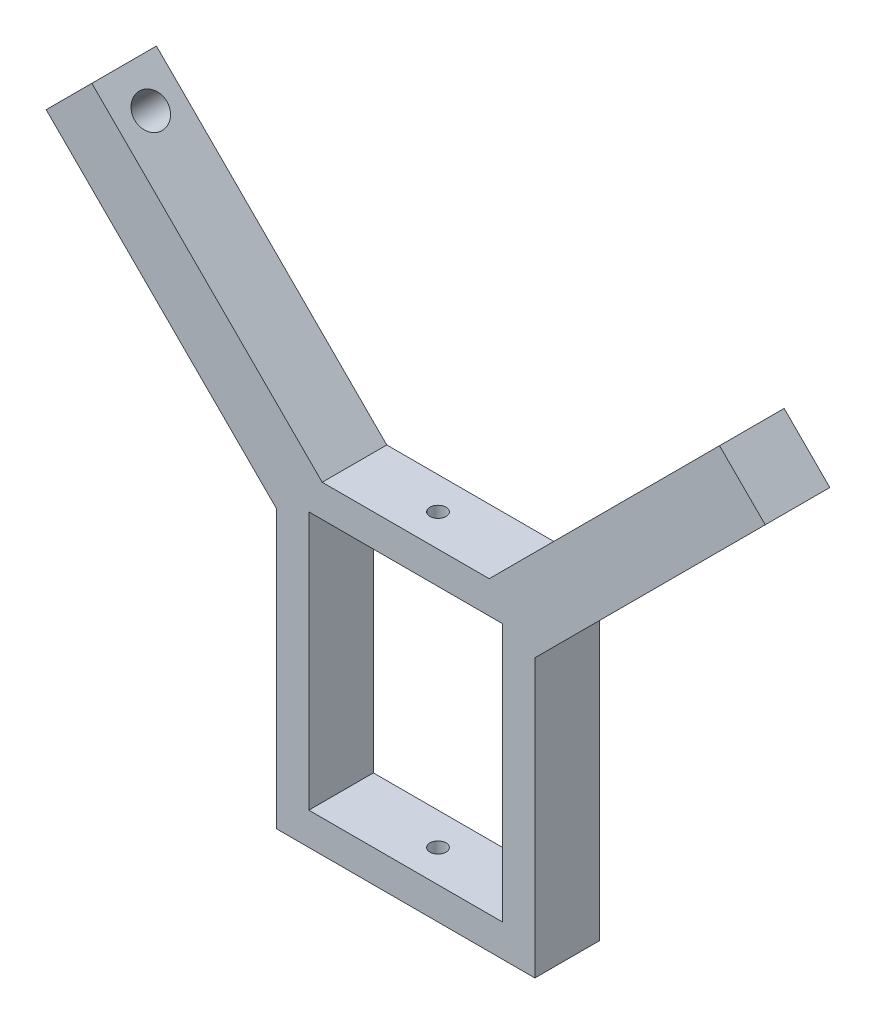
ISO-10303-21;
HEADER;
FILE_DESCRIPTION(('STEP AP214'),'2;1');
FILE_NAME('part.step','',(''),(''),'','','');
FILE_SCHEMA(('AUTOMOTIVE_DESIGN { 1 0 10303 214 1 1 1 1 }'));
ENDSEC;
DATA;
#1=APPLICATION_CONTEXT('core data for automotive mechanical design processes');
#2=APPLICATION_PROTOCOL_DEFINITION('international standard','automotive_design',2000,#1);
#3=PRODUCT_CONTEXT('',#1,'mechanical');
#4=PRODUCT('Part','Part','',(#3));
#5=PRODUCT_RELATED_PRODUCT_CATEGORY('part','',(#4));
#6=PRODUCT_DEFINITION_FORMATION('','',#4);
#7=PRODUCT_DEFINITION_CONTEXT('part definition',#1,'design');
#8=PRODUCT_DEFINITION('design','',#6,#7);
#9=PRODUCT_DEFINITION_SHAPE('','',#8);
#10=(LENGTH_UNIT() NAMED_UNIT(*) SI_UNIT(.MILLI.,.METRE.));
#11=(NAMED_UNIT(*) PLANE_ANGLE_UNIT() SI_UNIT($,.RADIAN.));
#12=(NAMED_UNIT(*) SI_UNIT($,.STERADIAN.) SOLID_ANGLE_UNIT());
#13=UNCERTAINTY_MEASURE_WITH_UNIT(LENGTH_MEASURE(1.E-05),#10,'distance_accuracy_value','');
#14=(GEOMETRIC_REPRESENTATION_CONTEXT(3) GLOBAL_UNCERTAINTY_ASSIGNED_CONTEXT((#13)) GLOBAL_UNIT_ASSIGNED_CONTEXT((#10,
#11,#12)) REPRESENTATION_CONTEXT('',''));
#15=CARTESIAN_POINT('',(0.,0.,0.));
#16=DIRECTION('',(0.,0.,1.));
#17=DIRECTION('',(1.,0.,0.));
#18=AXIS2_PLACEMENT_3D('',#15,#16,#17);
#19=CARTESIAN_POINT('',(10.,-100.,10.));
#20=DIRECTION('',(1.,0.,0.));
#21=DIRECTION('',(0.,1.,0.));
#22=AXIS2_PLACEMENT_3D('',#19,#20,#21);
#23=PLANE('',#22);
#24=DIRECTION('',(0.,0.,1.));
#25=VECTOR('',#24,1.);
#26=CARTESIAN_POINT('',(10.,-104.142135623731,10.));
#27=LINE('',#26,#25);
#28=CARTESIAN_POINT('',(10.,-104.142135623731,-10.));
#29=VERTEX_POINT('',#28);
#30=CARTESIAN_POINT('',(10.,-104.142135623731,10.));
#31=VERTEX_POINT('',#30);
#32=EDGE_CURVE('E65',#29,#31,#27,.T.);
#33=ORIENTED_EDGE('',*,*,#32,.F.);
#34=DIRECTION('',(0.,-1.,0.));
#35=VECTOR('',#34,1.);
#36=CARTESIAN_POINT('',(10.,-100.,-10.));
#37=LINE('',#36,#35);
#38=CARTESIAN_POINT('',(10.,-190.,-10.));
#39=VERTEX_POINT('',#38);
#40=EDGE_CURVE('E251',#29,#39,#37,.T.);
#41=ORIENTED_EDGE('',*,*,#40,.T.);
#42=DIRECTION('',(0.,0.,-1.));
#43=VECTOR('',#42,1.);
#44=CARTESIAN_POINT('',(10.,-190.,10.));
#45=LINE('',#44,#43);
#46=CARTESIAN_POINT('',(10.,-190.,10.));
#47=VERTEX_POINT('',#46);
#48=EDGE_CURVE('E268',#47,#39,#45,.T.);
#49=ORIENTED_EDGE('',*,*,#48,.F.);
#50=DIRECTION('',(0.,-1.,0.));
#51=VECTOR('',#50,1.);
#52=CARTESIAN_POINT('',(10.,-100.,10.));
#53=LINE('',#52,#51);
#54=EDGE_CURVE('E252',#31,#47,#53,.T.);
#55=ORIENTED_EDGE('',*,*,#54,.F.);
#56=EDGE_LOOP('',(#33,#41,#49,#55));
#57=FACE_BOUND('',#56,.T.);
#58=ADVANCED_FACE('F57',(#57),#23,.F.);
#59=CARTESIAN_POINT('',(20.,-90.,10.));
#60=DIRECTION('',(0.,-1.,0.));
#61=DIRECTION('',(0.,0.,-1.));
#62=AXIS2_PLACEMENT_3D('',#59,#60,#61);
#63=PLANE('',#62);
#64=CARTESIAN_POINT('',(50.,-90.,0.));
#65=DIRECTION('',(0.,-1.,0.));
#66=DIRECTION('',(0.,0.,-1.));
#67=AXIS2_PLACEMENT_3D('',#64,#65,#66);
#68=CIRCLE('',#67,2.5);
#69=CARTESIAN_POINT('',(50.,-90.,2.5));
#70=VERTEX_POINT('',#69);
#71=EDGE_CURVE('E351',#70,#70,#68,.T.);
#72=ORIENTED_EDGE('',*,*,#71,.T.);
#73=EDGE_LOOP('',(#72));
#74=FACE_BOUND('',#73,.T.);
#75=DIRECTION('',(-1.,0.,0.));
#76=VECTOR('',#75,1.);
#77=CARTESIAN_POINT('',(20.,-90.,10.));
#78=LINE('',#77,#76);
#79=CARTESIAN_POINT('',(75.857864376269,-90.,10.));
#80=VERTEX_POINT('',#79);
#81=CARTESIAN_POINT('',(24.142135623731,-90.,10.));
#82=VERTEX_POINT('',#81);
#83=EDGE_CURVE('E72',#80,#82,#78,.T.);
#84=ORIENTED_EDGE('',*,*,#83,.F.);
#85=DIRECTION('',(0.,0.,-1.));
#86=VECTOR('',#85,1.);
#87=CARTESIAN_POINT('',(75.857864376269,-90.,10.));
#88=LINE('',#87,#86);
#89=CARTESIAN_POINT('',(75.857864376269,-90.,-10.));
#90=VERTEX_POINT('',#89);
#91=EDGE_CURVE('E76',#80,#90,#88,.T.);
#92=ORIENTED_EDGE('',*,*,#91,.T.);
#93=DIRECTION('',(-1.,0.,0.));
#94=VECTOR('',#93,1.);
#95=CARTESIAN_POINT('',(20.,-90.,-10.));
#96=LINE('',#95,#94);
#97=CARTESIAN_POINT('',(24.142135623731,-90.,-10.));
#98=VERTEX_POINT('',#97);
#99=EDGE_CURVE('E255',#90,#98,#96,.T.);
#100=ORIENTED_EDGE('',*,*,#99,.T.);
#101=DIRECTION('',(0.,0.,-1.));
#102=VECTOR('',#101,1.);
#103=CARTESIAN_POINT('',(24.142135623731,-90.,10.));
#104=LINE('',#103,#102);
#105=EDGE_CURVE('E271',#82,#98,#104,.T.);
#106=ORIENTED_EDGE('',*,*,#105,.F.);
#107=EDGE_LOOP('',(#84,#92,#100,#106));
#108=FACE_BOUND('',#107,.T.);
#109=ADVANCED_FACE('F304',(#74,#108),#63,.F.);
#110=CARTESIAN_POINT('',(0.,0.,10.));
#111=DIRECTION('',(0.,0.,1.));
#112=DIRECTION('',(1.,0.,0.));
#113=AXIS2_PLACEMENT_3D('',#110,#111,#112);
#114=PLANE('',#113);
#115=DIRECTION('',(0.707106781186547,0.707106781186548,0.));
#116=VECTOR('',#115,1.);
#117=CARTESIAN_POINT('',(72.9289321881345,-92.9289321881345,10.));
#118=LINE('',#117,#116);
#119=CARTESIAN_POINT('',(147.175144212722,-18.682720163547,10.));
#120=VERTEX_POINT('',#119);
#121=EDGE_CURVE('E182',#80,#120,#118,.T.);
#122=ORIENTED_EDGE('',*,*,#121,.F.);
#123=ORIENTED_EDGE('',*,*,#83,.T.);
#124=DIRECTION('',(-0.707106781186547,0.707106781186548,0.));
#125=VECTOR('',#124,1.);
#126=CARTESIAN_POINT('',(27.0710678118655,-92.9289321881345,10.));
#127=LINE('',#126,#125);
#128=CARTESIAN_POINT('',(-47.175144212722,-18.682720163547,10.));
#129=VERTEX_POINT('',#128);
#130=EDGE_CURVE('E201',#82,#129,#127,.T.);
#131=ORIENTED_EDGE('',*,*,#130,.T.);
#132=DIRECTION('',(-0.707106781186547,-0.707106781186547,0.));
#133=VECTOR('',#132,1.);
#134=CARTESIAN_POINT('',(-47.175144212722,-18.682720163547,10.));
#135=LINE('',#134,#133);
#136=CARTESIAN_POINT('',(-61.317279836453,-32.824855787278,10.));
#137=VERTEX_POINT('',#136);
#138=EDGE_CURVE('E203',#129,#137,#135,.T.);
#139=ORIENTED_EDGE('',*,*,#138,.T.);
#140=DIRECTION('',(0.707106781186548,-0.707106781186548,0.));
#141=VECTOR('',#140,1.);
#142=CARTESIAN_POINT('',(12.9289321881345,-107.071067811865,10.));
#143=LINE('',#142,#141);
#144=EDGE_CURVE('E206',#137,#31,#143,.T.);
#145=ORIENTED_EDGE('',*,*,#144,.T.);
#146=ORIENTED_EDGE('',*,*,#54,.T.);
#147=DIRECTION('',(1.,0.,0.));
#148=VECTOR('',#147,1.);
#149=CARTESIAN_POINT('',(20.,-190.,10.));
#150=LINE('',#149,#148);
#151=CARTESIAN_POINT('',(90.,-190.,10.));
#152=VERTEX_POINT('',#151);
#153=EDGE_CURVE('E254',#47,#152,#150,.T.);
#154=ORIENTED_EDGE('',*,*,#153,.T.);
#155=DIRECTION('',(0.,1.,0.));
#156=VECTOR('',#155,1.);
#157=CARTESIAN_POINT('',(90.,-100.,10.));
#158=LINE('',#157,#156);
#159=CARTESIAN_POINT('',(90.,-104.142135623731,10.));
#160=VERTEX_POINT('',#159);
#161=EDGE_CURVE('E176',#152,#160,#158,.T.);
#162=ORIENTED_EDGE('',*,*,#161,.T.);
#163=DIRECTION('',(-0.707106781186547,-0.707106781186548,0.));
#164=VECTOR('',#163,1.);
#165=CARTESIAN_POINT('',(87.0710678118655,-107.071067811865,10.));
#166=LINE('',#165,#164);
#167=CARTESIAN_POINT('',(161.317279836453,-32.824855787278,10.));
#168=VERTEX_POINT('',#167);
#169=EDGE_CURVE('E159',#168,#160,#166,.T.);
#170=ORIENTED_EDGE('',*,*,#169,.F.);
#171=DIRECTION('',(0.707106781186548,-0.707106781186547,0.));
#172=VECTOR('',#171,1.);
#173=CARTESIAN_POINT('',(147.175144212722,-18.682720163547,10.));
#174=LINE('',#173,#172);
#175=EDGE_CURVE('E174',#120,#168,#174,.T.);
#176=ORIENTED_EDGE('',*,*,#175,.F.);
#177=EDGE_LOOP('',(#122,#123,#131,#139,#145,#146,#154,#162,#170,#176));
#178=FACE_BOUND('',#177,.T.);
#179=DIRECTION('',(-1.,0.,0.));
#180=VECTOR('',#179,1.);
#181=CARTESIAN_POINT('',(20.,-100.,10.));
#182=LINE('',#181,#180);
#183=CARTESIAN_POINT('',(80.,-100.,10.));
#184=VERTEX_POINT('',#183);
#185=CARTESIAN_POINT('',(20.,-100.,10.));
#186=VERTEX_POINT('',#185);
#187=EDGE_CURVE('E229',#184,#186,#182,.T.);
#188=ORIENTED_EDGE('',*,*,#187,.F.);
#189=DIRECTION('',(0.,1.,0.));
#190=VECTOR('',#189,1.);
#191=CARTESIAN_POINT('',(80.,-100.,10.));
#192=LINE('',#191,#190);
#193=CARTESIAN_POINT('',(80.,-180.,10.));
#194=VERTEX_POINT('',#193);
#195=EDGE_CURVE('E226',#194,#184,#192,.T.);
#196=ORIENTED_EDGE('',*,*,#195,.F.);
#197=DIRECTION('',(1.,0.,0.));
#198=VECTOR('',#197,1.);
#199=CARTESIAN_POINT('',(20.,-180.,10.));
#200=LINE('',#199,#198);
#201=CARTESIAN_POINT('',(20.,-180.,10.));
#202=VERTEX_POINT('',#201);
#203=EDGE_CURVE('E223',#202,#194,#200,.T.);
#204=ORIENTED_EDGE('',*,*,#203,.F.);
#205=DIRECTION('',(0.,-1.,0.));
#206=VECTOR('',#205,1.);
#207=CARTESIAN_POINT('',(20.,-100.,10.));
#208=LINE('',#207,#206);
#209=EDGE_CURVE('E221',#186,#202,#208,.T.);
#210=ORIENTED_EDGE('',*,*,#209,.F.);
#211=EDGE_LOOP('',(#188,#196,#204,#210));
#212=FACE_BOUND('',#211,.T.);
#213=ADVANCED_FACE('F172',(#178,#212),#114,.T.);
#214=CARTESIAN_POINT('',(0.,0.,-10.));
#215=DIRECTION('',(0.,0.,1.));
#216=DIRECTION('',(1.,0.,0.));
#217=AXIS2_PLACEMENT_3D('',#214,#215,#216);
#218=PLANE('',#217);
#219=ORIENTED_EDGE('',*,*,#99,.F.);
#220=DIRECTION('',(0.707106781186547,0.707106781186548,0.));
#221=VECTOR('',#220,1.);
#222=CARTESIAN_POINT('',(72.9289321881345,-92.9289321881345,-10.));
#223=LINE('',#222,#221);
#224=CARTESIAN_POINT('',(147.175144212722,-18.682720163547,-10.));
#225=VERTEX_POINT('',#224);
#226=EDGE_CURVE('E177',#90,#225,#223,.T.);
#227=ORIENTED_EDGE('',*,*,#226,.T.);
#228=DIRECTION('',(0.707106781186548,-0.707106781186547,0.));
#229=VECTOR('',#228,1.);
#230=CARTESIAN_POINT('',(147.175144212722,-18.682720163547,-10.));
#231=LINE('',#230,#229);
#232=CARTESIAN_POINT('',(161.317279836453,-32.824855787278,-10.));
#233=VERTEX_POINT('',#232);
#234=EDGE_CURVE('E188',#225,#233,#231,.T.);
#235=ORIENTED_EDGE('',*,*,#234,.T.);
#236=DIRECTION('',(-0.707106781186547,-0.707106781186548,0.));
#237=VECTOR('',#236,1.);
#238=CARTESIAN_POINT('',(87.0710678118655,-107.071067811865,-10.));
#239=LINE('',#238,#237);
#240=CARTESIAN_POINT('',(90.,-104.142135623731,-10.));
#241=VERTEX_POINT('',#240);
#242=EDGE_CURVE('E161',#233,#241,#239,.T.);
#243=ORIENTED_EDGE('',*,*,#242,.T.);
#244=DIRECTION('',(0.,1.,0.));
#245=VECTOR('',#244,1.);
#246=CARTESIAN_POINT('',(90.,-100.,-10.));
#247=LINE('',#246,#245);
#248=CARTESIAN_POINT('',(90.,-190.,-10.));
#249=VERTEX_POINT('',#248);
#250=EDGE_CURVE('E263',#249,#241,#247,.T.);
#251=ORIENTED_EDGE('',*,*,#250,.F.);
#252=DIRECTION('',(1.,0.,0.));
#253=VECTOR('',#252,1.);
#254=CARTESIAN_POINT('',(20.,-190.,-10.));
#255=LINE('',#254,#253);
#256=EDGE_CURVE('E261',#39,#249,#255,.T.);
#257=ORIENTED_EDGE('',*,*,#256,.F.);
#258=ORIENTED_EDGE('',*,*,#40,.F.);
#259=DIRECTION('',(0.707106781186548,-0.707106781186548,0.));
#260=VECTOR('',#259,1.);
#261=CARTESIAN_POINT('',(12.9289321881345,-107.071067811865,-10.));
#262=LINE('',#261,#260);
#263=CARTESIAN_POINT('',(-61.317279836453,-32.824855787278,-10.));
#264=VERTEX_POINT('',#263);
#265=EDGE_CURVE('E204',#264,#29,#262,.T.);
#266=ORIENTED_EDGE('',*,*,#265,.F.);
#267=DIRECTION('',(-0.707106781186547,-0.707106781186547,0.));
#268=VECTOR('',#267,1.);
#269=CARTESIAN_POINT('',(-47.175144212722,-18.682720163547,-10.));
#270=LINE('',#269,#268);
#271=CARTESIAN_POINT('',(-47.175144212722,-18.682720163547,-10.));
#272=VERTEX_POINT('',#271);
#273=EDGE_CURVE('E211',#272,#264,#270,.T.);
#274=ORIENTED_EDGE('',*,*,#273,.F.);
#275=DIRECTION('',(-0.707106781186547,0.707106781186548,0.));
#276=VECTOR('',#275,1.);
#277=CARTESIAN_POINT('',(27.0710678118655,-92.9289321881345,-10.));
#278=LINE('',#277,#276);
#279=EDGE_CURVE('E200',#98,#272,#278,.T.);
#280=ORIENTED_EDGE('',*,*,#279,.F.);
#281=EDGE_LOOP('',(#219,#227,#235,#243,#251,#257,#258,#266,#274,#280));
#282=FACE_BOUND('',#281,.T.);
#283=DIRECTION('',(0.,1.,0.));
#284=VECTOR('',#283,1.);
#285=CARTESIAN_POINT('',(80.,-100.,-10.));
#286=LINE('',#285,#284);
#287=CARTESIAN_POINT('',(80.,-180.,-10.));
#288=VERTEX_POINT('',#287);
#289=CARTESIAN_POINT('',(80.,-100.,-10.));
#290=VERTEX_POINT('',#289);
#291=EDGE_CURVE('E237',#288,#290,#286,.T.);
#292=ORIENTED_EDGE('',*,*,#291,.T.);
#293=DIRECTION('',(-1.,0.,0.));
#294=VECTOR('',#293,1.);
#295=CARTESIAN_POINT('',(20.,-100.,-10.));
#296=LINE('',#295,#294);
#297=CARTESIAN_POINT('',(20.,-100.,-10.));
#298=VERTEX_POINT('',#297);
#299=EDGE_CURVE('E224',#290,#298,#296,.T.);
#300=ORIENTED_EDGE('',*,*,#299,.T.);
#301=DIRECTION('',(0.,-1.,0.));
#302=VECTOR('',#301,1.);
#303=CARTESIAN_POINT('',(20.,-100.,-10.));
#304=LINE('',#303,#302);
#305=CARTESIAN_POINT('',(20.,-180.,-10.));
#306=VERTEX_POINT('',#305);
#307=EDGE_CURVE('E220',#298,#306,#304,.T.);
#308=ORIENTED_EDGE('',*,*,#307,.T.);
#309=DIRECTION('',(1.,0.,0.));
#310=VECTOR('',#309,1.);
#311=CARTESIAN_POINT('',(20.,-180.,-10.));
#312=LINE('',#311,#310);
#313=EDGE_CURVE('E234',#306,#288,#312,.T.);
#314=ORIENTED_EDGE('',*,*,#313,.T.);
#315=EDGE_LOOP('',(#292,#300,#308,#314));
#316=FACE_BOUND('',#315,.T.);
#317=ADVANCED_FACE('F290',(#282,#316),#218,.F.);
#318=CARTESIAN_POINT('',(20.,-190.,10.));
#319=DIRECTION('',(0.,1.,0.));
#320=DIRECTION('',(0.,0.,1.));
#321=AXIS2_PLACEMENT_3D('',#318,#319,#320);
#322=PLANE('',#321);
#323=CARTESIAN_POINT('',(50.,-190.,0.));
#324=DIRECTION('',(0.,1.,0.));
#325=DIRECTION('',(0.,0.,1.));
#326=AXIS2_PLACEMENT_3D('',#323,#324,#325);
#327=CIRCLE('',#326,2.5);
#328=CARTESIAN_POINT('',(50.,-190.,2.5));
#329=VERTEX_POINT('',#328);
#330=EDGE_CURVE('E343',#329,#329,#327,.T.);
#331=ORIENTED_EDGE('',*,*,#330,.T.);
#332=EDGE_LOOP('',(#331));
#333=FACE_BOUND('',#332,.T.);
#334=ORIENTED_EDGE('',*,*,#256,.T.);
#335=DIRECTION('',(0.,0.,-1.));
#336=VECTOR('',#335,1.);
#337=CARTESIAN_POINT('',(90.,-190.,10.));
#338=LINE('',#337,#336);
#339=EDGE_CURVE('E259',#152,#249,#338,.T.);
#340=ORIENTED_EDGE('',*,*,#339,.F.);
#341=ORIENTED_EDGE('',*,*,#153,.F.);
#342=ORIENTED_EDGE('',*,*,#48,.T.);
#343=EDGE_LOOP('',(#334,#340,#341,#342));
#344=FACE_BOUND('',#343,.T.);
#345=ADVANCED_FACE('F297',(#333,#344),#322,.F.);
#346=CARTESIAN_POINT('',(90.,-100.,10.));
#347=DIRECTION('',(-1.,0.,0.));
#348=DIRECTION('',(0.,-1.,0.));
#349=AXIS2_PLACEMENT_3D('',#346,#347,#348);
#350=PLANE('',#349);
#351=ORIENTED_EDGE('',*,*,#250,.T.);
#352=DIRECTION('',(0.,0.,1.));
#353=VECTOR('',#352,1.);
#354=CARTESIAN_POINT('',(90.,-104.142135623731,10.));
#355=LINE('',#354,#353);
#356=EDGE_CURVE('E12',#241,#160,#355,.T.);
#357=ORIENTED_EDGE('',*,*,#356,.T.);
#358=ORIENTED_EDGE('',*,*,#161,.F.);
#359=ORIENTED_EDGE('',*,*,#339,.T.);
#360=EDGE_LOOP('',(#351,#357,#358,#359));
#361=FACE_BOUND('',#360,.T.);
#362=ADVANCED_FACE('F300',(#361),#350,.F.);
#363=CARTESIAN_POINT('',(20.,-100.,10.));
#364=DIRECTION('',(1.,0.,0.));
#365=DIRECTION('',(0.,1.,0.));
#366=AXIS2_PLACEMENT_3D('',#363,#364,#365);
#367=PLANE('',#366);
#368=ORIENTED_EDGE('',*,*,#307,.F.);
#369=DIRECTION('',(0.,0.,-1.));
#370=VECTOR('',#369,1.);
#371=CARTESIAN_POINT('',(20.,-100.,10.));
#372=LINE('',#371,#370);
#373=EDGE_CURVE('E231',#186,#298,#372,.T.);
#374=ORIENTED_EDGE('',*,*,#373,.F.);
#375=ORIENTED_EDGE('',*,*,#209,.T.);
#376=DIRECTION('',(0.,0.,-1.));
#377=VECTOR('',#376,1.);
#378=CARTESIAN_POINT('',(20.,-180.,10.));
#379=LINE('',#378,#377);
#380=EDGE_CURVE('E248',#202,#306,#379,.T.);
#381=ORIENTED_EDGE('',*,*,#380,.T.);
#382=EDGE_LOOP('',(#368,#374,#375,#381));
#383=FACE_BOUND('',#382,.T.);
#384=ADVANCED_FACE('F335',(#383),#367,.T.);
#385=CARTESIAN_POINT('',(20.,-180.,10.));
#386=DIRECTION('',(0.,1.,0.));
#387=DIRECTION('',(0.,0.,1.));
#388=AXIS2_PLACEMENT_3D('',#385,#386,#387);
#389=PLANE('',#388);
#390=CARTESIAN_POINT('',(50.,-180.,0.));
#391=DIRECTION('',(0.,1.,0.));
#392=DIRECTION('',(0.,0.,1.));
#393=AXIS2_PLACEMENT_3D('',#390,#391,#392);
#394=CIRCLE('',#393,2.5);
#395=CARTESIAN_POINT('',(50.,-180.,2.5));
#396=VERTEX_POINT('',#395);
#397=EDGE_CURVE('E347',#396,#396,#394,.T.);
#398=ORIENTED_EDGE('',*,*,#397,.F.);
#399=EDGE_LOOP('',(#398));
#400=FACE_BOUND('',#399,.T.);
#401=ORIENTED_EDGE('',*,*,#313,.F.);
#402=ORIENTED_EDGE('',*,*,#380,.F.);
#403=ORIENTED_EDGE('',*,*,#203,.T.);
#404=DIRECTION('',(0.,0.,-1.));
#405=VECTOR('',#404,1.);
#406=CARTESIAN_POINT('',(80.,-180.,10.));
#407=LINE('',#406,#405);
#408=EDGE_CURVE('E246',#194,#288,#407,.T.);
#409=ORIENTED_EDGE('',*,*,#408,.T.);
#410=EDGE_LOOP('',(#401,#402,#403,#409));
#411=FACE_BOUND('',#410,.T.);
#412=ADVANCED_FACE('F407',(#400,#411),#389,.T.);
#413=CARTESIAN_POINT('',(80.,-100.,10.));
#414=DIRECTION('',(-1.,0.,0.));
#415=DIRECTION('',(0.,-1.,0.));
#416=AXIS2_PLACEMENT_3D('',#413,#414,#415);
#417=PLANE('',#416);
#418=ORIENTED_EDGE('',*,*,#291,.F.);
#419=ORIENTED_EDGE('',*,*,#408,.F.);
#420=ORIENTED_EDGE('',*,*,#195,.T.);
#421=DIRECTION('',(0.,0.,-1.));
#422=VECTOR('',#421,1.);
#423=CARTESIAN_POINT('',(80.,-100.,10.));
#424=LINE('',#423,#422);
#425=EDGE_CURVE('E244',#184,#290,#424,.T.);
#426=ORIENTED_EDGE('',*,*,#425,.T.);
#427=EDGE_LOOP('',(#418,#419,#420,#426));
#428=FACE_BOUND('',#427,.T.);
#429=ADVANCED_FACE('F394',(#428),#417,.T.);
#430=CARTESIAN_POINT('',(20.,-100.,10.));
#431=DIRECTION('',(0.,-1.,0.));
#432=DIRECTION('',(0.,0.,-1.));
#433=AXIS2_PLACEMENT_3D('',#430,#431,#432);
#434=PLANE('',#433);
#435=CARTESIAN_POINT('',(50.,-100.,0.));
#436=DIRECTION('',(0.,-1.,0.));
#437=DIRECTION('',(0.,0.,-1.));
#438=AXIS2_PLACEMENT_3D('',#435,#436,#437);
#439=CIRCLE('',#438,2.5);
#440=CARTESIAN_POINT('',(50.,-100.,2.5));
#441=VERTEX_POINT('',#440);
#442=EDGE_CURVE('E60',#441,#441,#439,.T.);
#443=ORIENTED_EDGE('',*,*,#442,.F.);
#444=EDGE_LOOP('',(#443));
#445=FACE_BOUND('',#444,.T.);
#446=ORIENTED_EDGE('',*,*,#299,.F.);
#447=ORIENTED_EDGE('',*,*,#425,.F.);
#448=ORIENTED_EDGE('',*,*,#187,.T.);
#449=ORIENTED_EDGE('',*,*,#373,.T.);
#450=EDGE_LOOP('',(#446,#447,#448,#449));
#451=FACE_BOUND('',#450,.T.);
#452=ADVANCED_FACE('F316',(#445,#451),#434,.T.);
#453=CARTESIAN_POINT('',(12.9289321881345,-107.071067811865,10.));
#454=DIRECTION('',(0.707106781186548,0.707106781186548,0.));
#455=DIRECTION('',(-0.707106781186548,0.707106781186548,0.));
#456=AXIS2_PLACEMENT_3D('',#453,#454,#455);
#457=PLANE('',#456);
#458=CARTESIAN_POINT('',(-53.0710678118396,-41.0710678118914,6.93889390390723E-13));
#459=DIRECTION('',(-0.707106781186548,-0.707106781186547,0.));
#460=DIRECTION('',(0.707106781186547,-0.707106781186548,0.));
#461=AXIS2_PLACEMENT_3D('',#458,#459,#460);
#462=CIRCLE('',#461,5.00000000001024);
#463=CARTESIAN_POINT('',(-49.5355339058996,-44.6066017178313,6.93889390390723E-13));
#464=VERTEX_POINT('',#463);
#465=EDGE_CURVE('E194',#464,#464,#462,.T.);
#466=ORIENTED_EDGE('',*,*,#465,.F.);
#467=EDGE_LOOP('',(#466));
#468=FACE_BOUND('',#467,.T.);
#469=ORIENTED_EDGE('',*,*,#265,.T.);
#470=ORIENTED_EDGE('',*,*,#32,.T.);
#471=ORIENTED_EDGE('',*,*,#144,.F.);
#472=DIRECTION('',(0.,0.,-1.));
#473=VECTOR('',#472,1.);
#474=CARTESIAN_POINT('',(-61.317279836453,-32.824855787278,10.));
#475=LINE('',#474,#473);
#476=EDGE_CURVE('E209',#137,#264,#475,.T.);
#477=ORIENTED_EDGE('',*,*,#476,.T.);
#478=EDGE_LOOP('',(#469,#470,#471,#477));
#479=FACE_BOUND('',#478,.T.);
#480=ADVANCED_FACE('F277',(#468,#479),#457,.F.);
#481=CARTESIAN_POINT('',(27.0710678118655,-92.9289321881345,10.));
#482=DIRECTION('',(-0.707106781186548,-0.707106781186547,0.));
#483=DIRECTION('',(0.707106781186547,-0.707106781186548,0.));
#484=AXIS2_PLACEMENT_3D('',#481,#482,#483);
#485=PLANE('',#484);
#486=CARTESIAN_POINT('',(-38.9289321881086,-26.9289321881604,6.93889390390723E-13));
#487=DIRECTION('',(-0.707106781186548,-0.707106781186547,0.));
#488=DIRECTION('',(0.707106781186547,-0.707106781186548,0.));
#489=AXIS2_PLACEMENT_3D('',#486,#487,#488);
#490=CIRCLE('',#489,5.00000000001024);
#491=CARTESIAN_POINT('',(-35.3933982821686,-30.4644660941004,6.93889390390723E-13));
#492=VERTEX_POINT('',#491);
#493=EDGE_CURVE('E197',#492,#492,#490,.F.);
#494=ORIENTED_EDGE('',*,*,#493,.F.);
#495=EDGE_LOOP('',(#494));
#496=FACE_BOUND('',#495,.T.);
#497=ORIENTED_EDGE('',*,*,#130,.F.);
#498=ORIENTED_EDGE('',*,*,#105,.T.);
#499=ORIENTED_EDGE('',*,*,#279,.T.);
#500=DIRECTION('',(0.,0.,-1.));
#501=VECTOR('',#500,1.);
#502=CARTESIAN_POINT('',(-47.175144212722,-18.682720163547,10.));
#503=LINE('',#502,#501);
#504=EDGE_CURVE('E217',#129,#272,#503,.T.);
#505=ORIENTED_EDGE('',*,*,#504,.F.);
#506=EDGE_LOOP('',(#497,#498,#499,#505));
#507=FACE_BOUND('',#506,.T.);
#508=ADVANCED_FACE('F306',(#496,#507),#485,.F.);
#509=CARTESIAN_POINT('',(-47.175144212722,-18.682720163547,10.));
#510=DIRECTION('',(0.707106781186548,-0.707106781186548,0.));
#511=DIRECTION('',(0.707106781186548,0.707106781186548,0.));
#512=AXIS2_PLACEMENT_3D('',#509,#510,#511);
#513=PLANE('',#512);
#514=ORIENTED_EDGE('',*,*,#273,.T.);
#515=ORIENTED_EDGE('',*,*,#476,.F.);
#516=ORIENTED_EDGE('',*,*,#138,.F.);
#517=ORIENTED_EDGE('',*,*,#504,.T.);
#518=EDGE_LOOP('',(#514,#515,#516,#517));
#519=FACE_BOUND('',#518,.T.);
#520=ADVANCED_FACE('F287',(#519),#513,.F.);
#521=CARTESIAN_POINT('',(29.6596399182524,41.6596399182006,6.93889390390723E-13));
#522=DIRECTION('',(-0.707106781186548,-0.707106781186547,0.));
#523=DIRECTION('',(0.707106781186547,-0.707106781186548,0.));
#524=AXIS2_PLACEMENT_3D('',#521,#522,#523);
#525=CYLINDRICAL_SURFACE('',#524,5.00000000001024);
#526=ORIENTED_EDGE('',*,*,#465,.T.);
#527=EDGE_LOOP('',(#526));
#528=FACE_BOUND('',#527,.T.);
#529=ORIENTED_EDGE('',*,*,#493,.T.);
#530=EDGE_LOOP('',(#529));
#531=FACE_BOUND('',#530,.T.);
#532=ADVANCED_FACE('F314',(#528,#531),#525,.F.);
#533=CARTESIAN_POINT('',(72.9289321881345,-92.9289321881345,10.));
#534=DIRECTION('',(-0.707106781186548,0.707106781186547,0.));
#535=DIRECTION('',(-0.707106781186547,-0.707106781186548,0.));
#536=AXIS2_PLACEMENT_3D('',#533,#534,#535);
#537=PLANE('',#536);
#538=CARTESIAN_POINT('',(138.928932188109,-26.9289321881604,6.93889390390723E-13));
#539=DIRECTION('',(-0.707106781186548,0.707106781186547,0.));
#540=DIRECTION('',(-0.707106781186547,-0.707106781186548,0.));
#541=AXIS2_PLACEMENT_3D('',#538,#539,#540);
#542=CIRCLE('',#541,5.00000000001024);
#543=CARTESIAN_POINT('',(135.393398282169,-30.4644660941003,6.93889390390723E-13));
#544=VERTEX_POINT('',#543);
#545=EDGE_CURVE('E189',#544,#544,#542,.T.);
#546=ORIENTED_EDGE('',*,*,#545,.F.);
#547=EDGE_LOOP('',(#546));
#548=FACE_BOUND('',#547,.T.);
#549=ORIENTED_EDGE('',*,*,#91,.F.);
#550=ORIENTED_EDGE('',*,*,#121,.T.);
#551=DIRECTION('',(0.,0.,-1.));
#552=VECTOR('',#551,1.);
#553=CARTESIAN_POINT('',(147.175144212722,-18.682720163547,10.));
#554=LINE('',#553,#552);
#555=EDGE_CURVE('E166',#120,#225,#554,.T.);
#556=ORIENTED_EDGE('',*,*,#555,.T.);
#557=ORIENTED_EDGE('',*,*,#226,.F.);
#558=EDGE_LOOP('',(#549,#550,#556,#557));
#559=FACE_BOUND('',#558,.T.);
#560=ADVANCED_FACE('F303',(#548,#559),#537,.T.);
#561=CARTESIAN_POINT('',(87.0710678118655,-107.071067811865,10.));
#562=DIRECTION('',(0.707106781186548,-0.707106781186547,0.));
#563=DIRECTION('',(0.707106781186547,0.707106781186548,0.));
#564=AXIS2_PLACEMENT_3D('',#561,#562,#563);
#565=PLANE('',#564);
#566=CARTESIAN_POINT('',(153.07106781184,-41.0710678118913,6.93889390390723E-13));
#567=DIRECTION('',(-0.707106781186548,0.707106781186547,0.));
#568=DIRECTION('',(-0.707106781186547,-0.707106781186548,0.));
#569=AXIS2_PLACEMENT_3D('',#566,#567,#568);
#570=CIRCLE('',#569,5.00000000001024);
#571=CARTESIAN_POINT('',(149.5355339059,-44.6066017178313,6.93889390390723E-13));
#572=VERTEX_POINT('',#571);
#573=EDGE_CURVE('E353',#572,#572,#570,.T.);
#574=ORIENTED_EDGE('',*,*,#573,.T.);
#575=EDGE_LOOP('',(#574));
#576=FACE_BOUND('',#575,.T.);
#577=ORIENTED_EDGE('',*,*,#356,.F.);
#578=ORIENTED_EDGE('',*,*,#242,.F.);
#579=DIRECTION('',(0.,0.,-1.));
#580=VECTOR('',#579,1.);
#581=CARTESIAN_POINT('',(161.317279836453,-32.824855787278,10.));
#582=LINE('',#581,#580);
#583=EDGE_CURVE('E155',#168,#233,#582,.T.);
#584=ORIENTED_EDGE('',*,*,#583,.F.);
#585=ORIENTED_EDGE('',*,*,#169,.T.);
#586=EDGE_LOOP('',(#577,#578,#584,#585));
#587=FACE_BOUND('',#586,.T.);
#588=ADVANCED_FACE('F158',(#576,#587),#565,.T.);
#589=CARTESIAN_POINT('',(147.175144212722,-18.682720163547,10.));
#590=DIRECTION('',(0.707106781186547,0.707106781186548,0.));
#591=DIRECTION('',(-0.707106781186548,0.707106781186547,0.));
#592=AXIS2_PLACEMENT_3D('',#589,#590,#591);
#593=PLANE('',#592);
#594=ORIENTED_EDGE('',*,*,#234,.F.);
#595=ORIENTED_EDGE('',*,*,#555,.F.);
#596=ORIENTED_EDGE('',*,*,#175,.T.);
#597=ORIENTED_EDGE('',*,*,#583,.T.);
#598=EDGE_LOOP('',(#594,#595,#596,#597));
#599=FACE_BOUND('',#598,.T.);
#600=ADVANCED_FACE('F180',(#599),#593,.T.);
#601=CARTESIAN_POINT('',(34.681720163521,77.3182798364271,6.93889390390723E-13));
#602=DIRECTION('',(0.707106781186548,-0.707106781186547,0.));
#603=DIRECTION('',(0.707106781186547,0.707106781186548,0.));
#604=AXIS2_PLACEMENT_3D('',#601,#602,#603);
#605=CYLINDRICAL_SURFACE('',#604,5.00000000001024);
#606=ORIENTED_EDGE('',*,*,#545,.T.);
#607=EDGE_LOOP('',(#606));
#608=FACE_BOUND('',#607,.T.);
#609=ORIENTED_EDGE('',*,*,#573,.F.);
#610=EDGE_LOOP('',(#609));
#611=FACE_BOUND('',#610,.T.);
#612=ADVANCED_FACE('F358',(#608,#611),#605,.F.);
#613=CARTESIAN_POINT('',(50.,-190.,0.));
#614=DIRECTION('',(0.,1.,0.));
#615=DIRECTION('',(0.,0.,1.));
#616=AXIS2_PLACEMENT_3D('',#613,#614,#615);
#617=CYLINDRICAL_SURFACE('',#616,2.5);
#618=CARTESIAN_POINT('',(50.,-100.,2.5));
#619=CARTESIAN_POINT('',(50.,-99.8958333333333,2.5));
#620=CARTESIAN_POINT('',(50.,-99.7916666666667,2.5));
#621=CARTESIAN_POINT('',(50.,-99.5833333333333,2.5));
#622=CARTESIAN_POINT('',(50.,-99.4791666666667,2.5));
#623=CARTESIAN_POINT('',(50.,-99.2708333333333,2.5));
#624=CARTESIAN_POINT('',(50.,-99.1666666666667,2.5));
#625=CARTESIAN_POINT('',(50.,-98.9583333333333,2.5));
#626=CARTESIAN_POINT('',(50.,-98.8541666666667,2.5));
#627=CARTESIAN_POINT('',(50.,-98.6458333333333,2.5));
#628=CARTESIAN_POINT('',(50.,-98.5416666666667,2.5));
#629=CARTESIAN_POINT('',(50.,-98.3333333333333,2.5));
#630=CARTESIAN_POINT('',(50.,-98.2291666666667,2.5));
#631=CARTESIAN_POINT('',(50.,-98.0208333333333,2.5));
#632=CARTESIAN_POINT('',(50.,-97.9166666666667,2.5));
#633=CARTESIAN_POINT('',(50.,-97.7083333333333,2.5));
#634=CARTESIAN_POINT('',(50.,-97.6041666666667,2.5));
#635=CARTESIAN_POINT('',(50.,-97.3958333333333,2.5));
#636=CARTESIAN_POINT('',(50.,-97.2916666666667,2.5));
#637=CARTESIAN_POINT('',(50.,-97.0833333333333,2.5));
#638=CARTESIAN_POINT('',(50.,-96.9791666666667,2.5));
#639=CARTESIAN_POINT('',(50.,-96.7708333333333,2.5));
#640=CARTESIAN_POINT('',(50.,-96.6666666666667,2.5));
#641=CARTESIAN_POINT('',(50.,-96.4583333333333,2.5));
#642=CARTESIAN_POINT('',(50.,-96.3541666666667,2.5));
#643=CARTESIAN_POINT('',(50.,-96.1458333333333,2.5));
#644=CARTESIAN_POINT('',(50.,-96.0416666666667,2.5));
#645=CARTESIAN_POINT('',(50.,-95.8333333333333,2.5));
#646=CARTESIAN_POINT('',(50.,-95.7291666666667,2.5));
#647=CARTESIAN_POINT('',(50.,-95.5208333333333,2.5));
#648=CARTESIAN_POINT('',(50.,-95.4166666666667,2.5));
#649=CARTESIAN_POINT('',(50.,-95.2083333333333,2.5));
#650=CARTESIAN_POINT('',(50.,-95.1041666666667,2.5));
#651=CARTESIAN_POINT('',(50.,-94.8958333333333,2.5));
#652=CARTESIAN_POINT('',(50.,-94.7916666666667,2.5));
#653=CARTESIAN_POINT('',(50.,-94.5833333333333,2.5));
#654=CARTESIAN_POINT('',(50.,-94.4791666666667,2.5));
#655=CARTESIAN_POINT('',(50.,-94.2708333333333,2.5));
#656=CARTESIAN_POINT('',(50.,-94.1666666666667,2.5));
#657=CARTESIAN_POINT('',(50.,-93.9583333333333,2.5));
#658=CARTESIAN_POINT('',(50.,-93.8541666666667,2.5));
#659=CARTESIAN_POINT('',(50.,-93.6458333333333,2.5));
#660=CARTESIAN_POINT('',(50.,-93.5416666666667,2.5));
#661=CARTESIAN_POINT('',(50.,-93.3333333333333,2.5));
#662=CARTESIAN_POINT('',(50.,-93.2291666666667,2.5));
#663=CARTESIAN_POINT('',(50.,-93.0208333333333,2.5));
#664=CARTESIAN_POINT('',(50.,-92.9166666666667,2.5));
#665=CARTESIAN_POINT('',(50.,-92.7083333333333,2.5));
#666=CARTESIAN_POINT('',(50.,-92.6041666666667,2.5));
#667=CARTESIAN_POINT('',(50.,-92.3958333333333,2.5));
#668=CARTESIAN_POINT('',(50.,-92.2916666666667,2.5));
#669=CARTESIAN_POINT('',(50.,-92.0833333333333,2.5));
#670=CARTESIAN_POINT('',(50.,-91.9791666666667,2.5));
#671=CARTESIAN_POINT('',(50.,-91.7708333333333,2.5));
#672=CARTESIAN_POINT('',(50.,-91.6666666666667,2.5));
#673=CARTESIAN_POINT('',(50.,-91.4583333333333,2.5));
#674=CARTESIAN_POINT('',(50.,-91.3541666666667,2.5));
#675=CARTESIAN_POINT('',(50.,-91.1458333333333,2.5));
#676=CARTESIAN_POINT('',(50.,-91.0416666666667,2.5));
#677=CARTESIAN_POINT('',(50.,-90.8333333333333,2.5));
#678=CARTESIAN_POINT('',(50.,-90.7291666666667,2.5));
#679=CARTESIAN_POINT('',(50.,-90.5208333333333,2.5));
#680=CARTESIAN_POINT('',(50.,-90.4166666666667,2.5));
#681=CARTESIAN_POINT('',(50.,-90.2083333333333,2.5));
#682=CARTESIAN_POINT('',(50.,-90.1041666666667,2.5));
#683=CARTESIAN_POINT('',(50.,-90.,2.5));
#684=B_SPLINE_CURVE_WITH_KNOTS('',3,(#618,#619,#620,#621,#622,#623,#624,#625,#626,#627,#628,
#629,#630,#631,#632,#633,#634,#635,#636,#637,#638,#639,#640,#641,#642,#643,#644,#645,#646,#647,
#648,#649,#650,#651,#652,#653,#654,#655,#656,#657,#658,#659,#660,#661,#662,#663,#664,#665,#666,
#667,#668,#669,#670,#671,#672,#673,#674,#675,#676,#677,#678,#679,#680,#681,#682,#683),
.UNSPECIFIED.,.F.,.F.,(4,2,2,2,2,2,2,2,2,2,2,2,2,2,2,2,2,2,2,2,2,2,2,2,2,2,2,2,2,2,2,2,4),(0.,
0.312499999999993,0.625000000000001,0.937499999999994,1.25,1.56249999999999,1.875,2.1875,2.5,
2.8125,3.12499999999999,3.4375,3.74999999999999,4.0625,4.37499999999999,4.6875,4.99999999999999,
5.31249999999998,5.62499999999999,5.93749999999998,6.24999999999999,6.56249999999998,
6.87499999999999,7.18749999999999,7.49999999999998,7.81249999999999,8.12499999999998,
8.43749999999999,8.74999999999998,9.06249999999999,9.37499999999998,9.68749999999999,
9.99999999999998),.UNSPECIFIED.);
#685=EDGE_CURVE('BSEAM378',#441,#70,#684,.T.);
#686=ORIENTED_EDGE('',*,*,#442,.T.);
#687=ORIENTED_EDGE('',*,*,#71,.F.);
#688=ORIENTED_EDGE('',*,*,#685,.T.);
#689=ORIENTED_EDGE('',*,*,#685,.F.);
#690=EDGE_LOOP('',(#686,#688,#687,#689));
#691=FACE_BOUND('',#690,.T.);
#692=ADVANCED_FACE('F378',(#691),#617,.F.);
#693=CARTESIAN_POINT('',(50.,-180.,2.5));
#694=CARTESIAN_POINT('',(50.,-180.104166666667,2.5));
#695=CARTESIAN_POINT('',(50.,-180.208333333333,2.5));
#696=CARTESIAN_POINT('',(50.,-180.416666666667,2.5));
#697=CARTESIAN_POINT('',(50.,-180.520833333333,2.5));
#698=CARTESIAN_POINT('',(50.,-180.729166666667,2.5));
#699=CARTESIAN_POINT('',(50.,-180.833333333333,2.5));
#700=CARTESIAN_POINT('',(50.,-181.041666666667,2.5));
#701=CARTESIAN_POINT('',(50.,-181.145833333333,2.5));
#702=CARTESIAN_POINT('',(50.,-181.354166666667,2.5));
#703=CARTESIAN_POINT('',(50.,-181.458333333333,2.5));
#704=CARTESIAN_POINT('',(50.,-181.666666666667,2.5));
#705=CARTESIAN_POINT('',(50.,-181.770833333333,2.5));
#706=CARTESIAN_POINT('',(50.,-181.979166666667,2.5));
#707=CARTESIAN_POINT('',(50.,-182.083333333333,2.5));
#708=CARTESIAN_POINT('',(50.,-182.291666666667,2.5));
#709=CARTESIAN_POINT('',(50.,-182.395833333333,2.5));
#710=CARTESIAN_POINT('',(50.,-182.604166666667,2.5));
#711=CARTESIAN_POINT('',(50.,-182.708333333333,2.5));
#712=CARTESIAN_POINT('',(50.,-182.916666666667,2.5));
#713=CARTESIAN_POINT('',(50.,-183.020833333333,2.5));
#714=CARTESIAN_POINT('',(50.,-183.229166666667,2.5));
#715=CARTESIAN_POINT('',(50.,-183.333333333333,2.5));
#716=CARTESIAN_POINT('',(50.,-183.541666666667,2.5));
#717=CARTESIAN_POINT('',(50.,-183.645833333333,2.5));
#718=CARTESIAN_POINT('',(50.,-183.854166666667,2.5));
#719=CARTESIAN_POINT('',(50.,-183.958333333333,2.5));
#720=CARTESIAN_POINT('',(50.,-184.166666666667,2.5));
#721=CARTESIAN_POINT('',(50.,-184.270833333333,2.5));
#722=CARTESIAN_POINT('',(50.,-184.479166666667,2.5));
#723=CARTESIAN_POINT('',(50.,-184.583333333333,2.5));
#724=CARTESIAN_POINT('',(50.,-184.791666666667,2.5));
#725=CARTESIAN_POINT('',(50.,-184.895833333333,2.5));
#726=CARTESIAN_POINT('',(50.,-185.104166666667,2.5));
#727=CARTESIAN_POINT('',(50.,-185.208333333333,2.5));
#728=CARTESIAN_POINT('',(50.,-185.416666666667,2.5));
#729=CARTESIAN_POINT('',(50.,-185.520833333333,2.5));
#730=CARTESIAN_POINT('',(50.,-185.729166666667,2.5));
#731=CARTESIAN_POINT('',(50.,-185.833333333333,2.5));
#732=CARTESIAN_POINT('',(50.,-186.041666666667,2.5));
#733=CARTESIAN_POINT('',(50.,-186.145833333333,2.5));
#734=CARTESIAN_POINT('',(50.,-186.354166666667,2.5));
#735=CARTESIAN_POINT('',(50.,-186.458333333333,2.5));
#736=CARTESIAN_POINT('',(50.,-186.666666666667,2.5));
#737=CARTESIAN_POINT('',(50.,-186.770833333333,2.5));
#738=CARTESIAN_POINT('',(50.,-186.979166666667,2.5));
#739=CARTESIAN_POINT('',(50.,-187.083333333333,2.5));
#740=CARTESIAN_POINT('',(50.,-187.291666666667,2.5));
#741=CARTESIAN_POINT('',(50.,-187.395833333333,2.5));
#742=CARTESIAN_POINT('',(50.,-187.604166666667,2.5));
#743=CARTESIAN_POINT('',(50.,-187.708333333333,2.5));
#744=CARTESIAN_POINT('',(50.,-187.916666666667,2.5));
#745=CARTESIAN_POINT('',(50.,-188.020833333333,2.5));
#746=CARTESIAN_POINT('',(50.,-188.229166666667,2.5));
#747=CARTESIAN_POINT('',(50.,-188.333333333333,2.5));
#748=CARTESIAN_POINT('',(50.,-188.541666666667,2.5));
#749=CARTESIAN_POINT('',(50.,-188.645833333333,2.5));
#750=CARTESIAN_POINT('',(50.,-188.854166666667,2.5));
#751=CARTESIAN_POINT('',(50.,-188.958333333333,2.5));
#752=CARTESIAN_POINT('',(50.,-189.166666666667,2.5));
#753=CARTESIAN_POINT('',(50.,-189.270833333333,2.5));
#754=CARTESIAN_POINT('',(50.,-189.479166666667,2.5));
#755=CARTESIAN_POINT('',(50.,-189.583333333333,2.5));
#756=CARTESIAN_POINT('',(50.,-189.791666666667,2.5));
#757=CARTESIAN_POINT('',(50.,-189.895833333333,2.5));
#758=CARTESIAN_POINT('',(50.,-190.,2.5));
#759=B_SPLINE_CURVE_WITH_KNOTS('',3,(#693,#694,#695,#696,#697,#698,#699,#700,#701,#702,#703,
#704,#705,#706,#707,#708,#709,#710,#711,#712,#713,#714,#715,#716,#717,#718,#719,#720,#721,#722,
#723,#724,#725,#726,#727,#728,#729,#730,#731,#732,#733,#734,#735,#736,#737,#738,#739,#740,#741,
#742,#743,#744,#745,#746,#747,#748,#749,#750,#751,#752,#753,#754,#755,#756,#757,#758),
.UNSPECIFIED.,.F.,.F.,(4,2,2,2,2,2,2,2,2,2,2,2,2,2,2,2,2,2,2,2,2,2,2,2,2,2,2,2,2,2,2,2,4),(0.,
0.312499999999993,0.624999999999987,0.93749999999998,1.25,1.56249999999999,1.87499999999999,
2.18749999999998,2.5,2.8125,3.12499999999999,3.43749999999998,3.75,4.0625,4.37499999999999,
4.68749999999998,5.,5.3125,5.62499999999999,5.93749999999998,6.25000000000001,6.5625,
6.87499999999999,7.18749999999999,7.50000000000001,7.8125,8.12499999999999,8.43749999999999,
8.75000000000001,9.0625,9.37499999999999,9.68749999999999,9.99999999999998),.UNSPECIFIED.);
#760=EDGE_CURVE('BSEAM382',#396,#329,#759,.T.);
#761=ORIENTED_EDGE('',*,*,#397,.T.);
#762=ORIENTED_EDGE('',*,*,#330,.F.);
#763=ORIENTED_EDGE('',*,*,#760,.T.);
#764=ORIENTED_EDGE('',*,*,#760,.F.);
#765=EDGE_LOOP('',(#761,#763,#762,#764));
#766=FACE_BOUND('',#765,.T.);
#767=ADVANCED_FACE('F382',(#766),#617,.F.);
#768=CLOSED_SHELL('',(#58,#109,#213,#317,#345,#362,#384,#412,#429,#452,#480,#508,#520,#532,#560,
#588,#600,#612,#692,#767));
#769=MANIFOLD_SOLID_BREP('B2',#768);
#770=ADVANCED_BREP_SHAPE_REPRESENTATION('',(#18,#769),#14);
#771=SHAPE_DEFINITION_REPRESENTATION(#9,#770);
ENDSEC;
END-ISO-10303-21;
